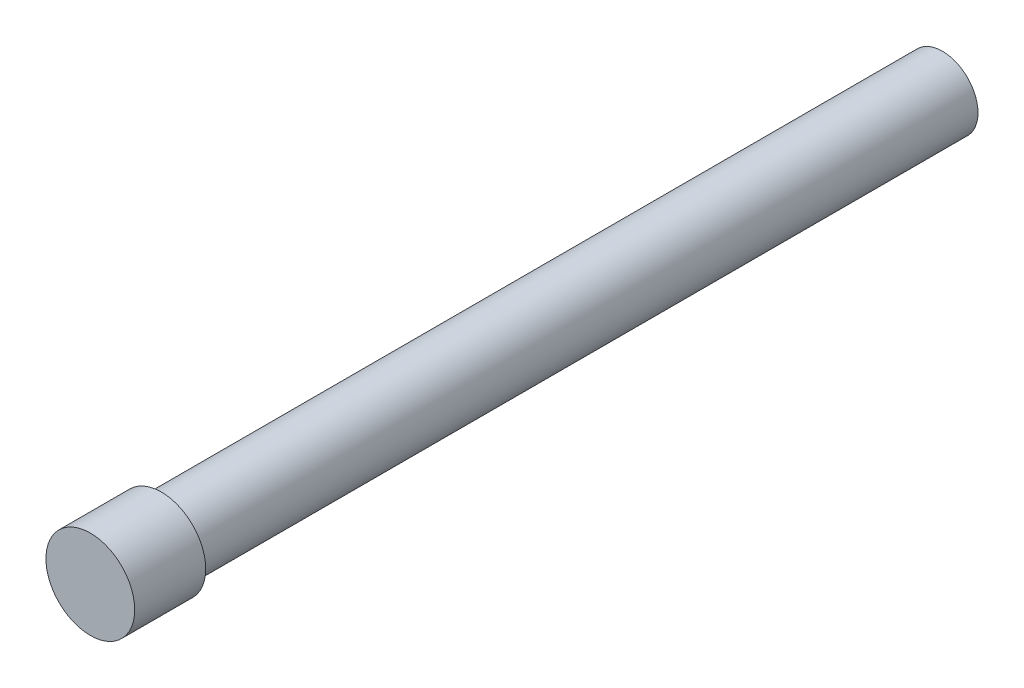
ISO-10303-21;
HEADER;
FILE_DESCRIPTION(('STEP AP214'),'2;1');
FILE_NAME('part.step','',(''),(''),'','','');
FILE_SCHEMA(('AUTOMOTIVE_DESIGN { 1 0 10303 214 1 1 1 1 }'));
ENDSEC;
DATA;
#1=APPLICATION_CONTEXT('core data for automotive mechanical design processes');
#2=APPLICATION_PROTOCOL_DEFINITION('international standard','automotive_design',2000,#1);
#3=PRODUCT_CONTEXT('',#1,'mechanical');
#4=PRODUCT('Part','Part','',(#3));
#5=PRODUCT_RELATED_PRODUCT_CATEGORY('part','',(#4));
#6=PRODUCT_DEFINITION_FORMATION('','',#4);
#7=PRODUCT_DEFINITION_CONTEXT('part definition',#1,'design');
#8=PRODUCT_DEFINITION('design','',#6,#7);
#9=PRODUCT_DEFINITION_SHAPE('','',#8);
#10=(LENGTH_UNIT() NAMED_UNIT(*) SI_UNIT(.MILLI.,.METRE.));
#11=(NAMED_UNIT(*) PLANE_ANGLE_UNIT() SI_UNIT($,.RADIAN.));
#12=(NAMED_UNIT(*) SI_UNIT($,.STERADIAN.) SOLID_ANGLE_UNIT());
#13=UNCERTAINTY_MEASURE_WITH_UNIT(LENGTH_MEASURE(1.E-05),#10,'distance_accuracy_value','');
#14=(GEOMETRIC_REPRESENTATION_CONTEXT(3) GLOBAL_UNCERTAINTY_ASSIGNED_CONTEXT((#13)) GLOBAL_UNIT_ASSIGNED_CONTEXT((#10,
#11,#12)) REPRESENTATION_CONTEXT('',''));
#15=CARTESIAN_POINT('',(0.,0.,0.));
#16=DIRECTION('',(0.,0.,1.));
#17=DIRECTION('',(1.,0.,0.));
#18=AXIS2_PLACEMENT_3D('',#15,#16,#17);
#19=CARTESIAN_POINT('',(0.,0.,22.));
#20=DIRECTION('',(0.,0.,-1.));
#21=DIRECTION('',(-1.,0.,0.));
#22=AXIS2_PLACEMENT_3D('',#19,#20,#21);
#23=CYLINDRICAL_SURFACE('',#22,1.);
#24=CARTESIAN_POINT('',(0.,0.,22.));
#25=DIRECTION('',(0.,0.,1.));
#26=DIRECTION('',(1.,0.,0.));
#27=AXIS2_PLACEMENT_3D('',#24,#25,#26);
#28=CIRCLE('',#27,1.);
#29=CARTESIAN_POINT('',(1.,0.,22.));
#30=VERTEX_POINT('',#29);
#31=EDGE_CURVE('E10',#30,#30,#28,.T.);
#32=ORIENTED_EDGE('',*,*,#31,.F.);
#33=EDGE_LOOP('',(#32));
#34=FACE_BOUND('',#33,.T.);
#35=CARTESIAN_POINT('',(0.,0.,0.));
#36=DIRECTION('',(0.,0.,1.));
#37=DIRECTION('',(1.,0.,0.));
#38=AXIS2_PLACEMENT_3D('',#35,#36,#37);
#39=CIRCLE('',#38,1.);
#40=CARTESIAN_POINT('',(1.,0.,0.));
#41=VERTEX_POINT('',#40);
#42=EDGE_CURVE('E36',#41,#41,#39,.T.);
#43=ORIENTED_EDGE('',*,*,#42,.T.);
#44=EDGE_LOOP('',(#43));
#45=FACE_BOUND('',#44,.T.);
#46=ADVANCED_FACE('F33',(#34,#45),#23,.T.);
#47=CARTESIAN_POINT('',(0.,0.,0.));
#48=DIRECTION('',(0.,0.,1.));
#49=DIRECTION('',(1.,0.,0.));
#50=AXIS2_PLACEMENT_3D('',#47,#48,#49);
#51=PLANE('',#50);
#52=ORIENTED_EDGE('',*,*,#42,.F.);
#53=EDGE_LOOP('',(#52));
#54=FACE_BOUND('',#53,.T.);
#55=ADVANCED_FACE('F56',(#54),#51,.F.);
#56=CARTESIAN_POINT('',(0.,0.,24.));
#57=DIRECTION('',(0.,0.,-1.));
#58=DIRECTION('',(-1.,0.,0.));
#59=AXIS2_PLACEMENT_3D('',#56,#57,#58);
#60=CYLINDRICAL_SURFACE('',#59,1.25);
#61=CARTESIAN_POINT('',(0.,0.,24.));
#62=DIRECTION('',(0.,0.,1.));
#63=DIRECTION('',(1.,0.,0.));
#64=AXIS2_PLACEMENT_3D('',#61,#62,#63);
#65=CIRCLE('',#64,1.25);
#66=CARTESIAN_POINT('',(1.25,0.,24.));
#67=VERTEX_POINT('',#66);
#68=EDGE_CURVE('E43',#67,#67,#65,.T.);
#69=ORIENTED_EDGE('',*,*,#68,.F.);
#70=EDGE_LOOP('',(#69));
#71=FACE_BOUND('',#70,.T.);
#72=CARTESIAN_POINT('',(0.,0.,22.));
#73=DIRECTION('',(0.,0.,1.));
#74=DIRECTION('',(1.,0.,0.));
#75=AXIS2_PLACEMENT_3D('',#72,#73,#74);
#76=CIRCLE('',#75,1.25);
#77=CARTESIAN_POINT('',(1.25,0.,22.));
#78=VERTEX_POINT('',#77);
#79=EDGE_CURVE('E45',#78,#78,#76,.T.);
#80=ORIENTED_EDGE('',*,*,#79,.T.);
#81=EDGE_LOOP('',(#80));
#82=FACE_BOUND('',#81,.T.);
#83=ADVANCED_FACE('F53',(#71,#82),#60,.T.);
#84=CARTESIAN_POINT('',(0.,0.,24.));
#85=DIRECTION('',(0.,0.,1.));
#86=DIRECTION('',(1.,0.,0.));
#87=AXIS2_PLACEMENT_3D('',#84,#85,#86);
#88=PLANE('',#87);
#89=ORIENTED_EDGE('',*,*,#68,.T.);
#90=EDGE_LOOP('',(#89));
#91=FACE_BOUND('',#90,.T.);
#92=ADVANCED_FACE('F51',(#91),#88,.T.);
#93=CARTESIAN_POINT('',(0.,0.,22.));
#94=DIRECTION('',(0.,0.,1.));
#95=DIRECTION('',(1.,0.,0.));
#96=AXIS2_PLACEMENT_3D('',#93,#94,#95);
#97=PLANE('',#96);
#98=ORIENTED_EDGE('',*,*,#31,.T.);
#99=EDGE_LOOP('',(#98));
#100=FACE_BOUND('',#99,.T.);
#101=ORIENTED_EDGE('',*,*,#79,.F.);
#102=EDGE_LOOP('',(#101));
#103=FACE_BOUND('',#102,.T.);
#104=ADVANCED_FACE('F60',(#100,#103),#97,.F.);
#105=CLOSED_SHELL('',(#46,#55,#83,#92,#104));
#106=MANIFOLD_SOLID_BREP('B2',#105);
#107=ADVANCED_BREP_SHAPE_REPRESENTATION('',(#18,#106),#14);
#108=SHAPE_DEFINITION_REPRESENTATION(#9,#107);
ENDSEC;
END-ISO-10303-21;
